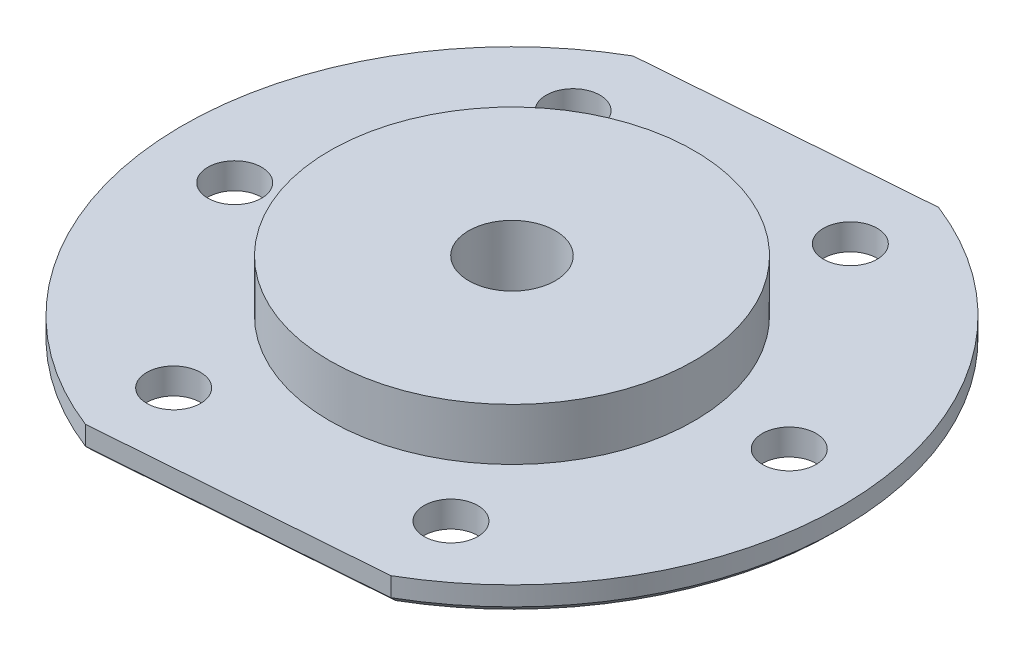
ISO-10303-21;
HEADER;
FILE_DESCRIPTION(('STEP AP214'),'2;1');
FILE_NAME('part.step','',(''),(''),'','','');
FILE_SCHEMA(('AUTOMOTIVE_DESIGN { 1 0 10303 214 1 1 1 1 }'));
ENDSEC;
DATA;
#1=APPLICATION_CONTEXT('core data for automotive mechanical design processes');
#2=APPLICATION_PROTOCOL_DEFINITION('international standard','automotive_design',2000,#1);
#3=PRODUCT_CONTEXT('',#1,'mechanical');
#4=PRODUCT('Part','Part','',(#3));
#5=PRODUCT_RELATED_PRODUCT_CATEGORY('part','',(#4));
#6=PRODUCT_DEFINITION_FORMATION('','',#4);
#7=PRODUCT_DEFINITION_CONTEXT('part definition',#1,'design');
#8=PRODUCT_DEFINITION('design','',#6,#7);
#9=PRODUCT_DEFINITION_SHAPE('','',#8);
#10=(LENGTH_UNIT() NAMED_UNIT(*) SI_UNIT(.MILLI.,.METRE.));
#11=(NAMED_UNIT(*) PLANE_ANGLE_UNIT() SI_UNIT($,.RADIAN.));
#12=(NAMED_UNIT(*) SI_UNIT($,.STERADIAN.) SOLID_ANGLE_UNIT());
#13=UNCERTAINTY_MEASURE_WITH_UNIT(LENGTH_MEASURE(1.E-05),#10,'distance_accuracy_value','');
#14=(GEOMETRIC_REPRESENTATION_CONTEXT(3) GLOBAL_UNCERTAINTY_ASSIGNED_CONTEXT((#13)) GLOBAL_UNIT_ASSIGNED_CONTEXT((#10,
#11,#12)) REPRESENTATION_CONTEXT('',''));
#15=CARTESIAN_POINT('',(0.,0.,0.));
#16=DIRECTION('',(0.,0.,1.));
#17=DIRECTION('',(1.,0.,0.));
#18=AXIS2_PLACEMENT_3D('',#15,#16,#17);
#19=CARTESIAN_POINT('',(0.,1.5,0.));
#20=DIRECTION('',(0.,-1.,0.));
#21=DIRECTION('',(0.,0.,-1.));
#22=AXIS2_PLACEMENT_3D('',#19,#20,#21);
#23=CYLINDRICAL_SURFACE('',#22,19.);
#24=DIRECTION('',(0.,1.,0.));
#25=VECTOR('',#24,1.);
#26=CARTESIAN_POINT('',(-9.48323529411764,0.,-16.4641503988636));
#27=LINE('',#26,#25);
#28=CARTESIAN_POINT('',(-9.48323529411764,0.399999999999998,-16.4641503988636));
#29=VERTEX_POINT('',#28);
#30=CARTESIAN_POINT('',(-9.48323529411764,1.5,-16.4641503988636));
#31=VERTEX_POINT('',#30);
#32=EDGE_CURVE('E195',#29,#31,#27,.T.);
#33=ORIENTED_EDGE('',*,*,#32,.F.);
#34=CARTESIAN_POINT('',(0.,0.399999999999998,0.));
#35=DIRECTION('',(0.,1.,0.));
#36=DIRECTION('',(0.,0.,1.));
#37=AXIS2_PLACEMENT_3D('',#34,#35,#36);
#38=CIRCLE('',#37,19.);
#39=CARTESIAN_POINT('',(-6.87848746298173,0.399999999999998,17.7111944888424));
#40=VERTEX_POINT('',#39);
#41=EDGE_CURVE('E130',#29,#40,#38,.T.);
#42=ORIENTED_EDGE('',*,*,#41,.T.);
#43=DIRECTION('',(0.,1.,0.));
#44=VECTOR('',#43,1.);
#45=CARTESIAN_POINT('',(-6.87848746298173,0.,17.7111944888424));
#46=LINE('',#45,#44);
#47=CARTESIAN_POINT('',(-6.87848746298173,1.5,17.7111944888425));
#48=VERTEX_POINT('',#47);
#49=EDGE_CURVE('E100',#40,#48,#46,.T.);
#50=ORIENTED_EDGE('',*,*,#49,.T.);
#51=CARTESIAN_POINT('',(0.,1.5,0.));
#52=DIRECTION('',(0.,1.,0.));
#53=DIRECTION('',(0.,0.,1.));
#54=AXIS2_PLACEMENT_3D('',#51,#52,#53);
#55=CIRCLE('',#54,19.);
#56=EDGE_CURVE('E109',#31,#48,#55,.T.);
#57=ORIENTED_EDGE('',*,*,#56,.F.);
#58=EDGE_LOOP('',(#33,#42,#50,#57));
#59=FACE_BOUND('',#58,.T.);
#60=ADVANCED_FACE('F35',(#59),#23,.T.);
#61=CARTESIAN_POINT('',(0.,1.5,0.));
#62=DIRECTION('',(0.,1.,0.));
#63=DIRECTION('',(0.,0.,1.));
#64=AXIS2_PLACEMENT_3D('',#61,#62,#63);
#65=PLANE('',#64);
#66=CARTESIAN_POINT('',(0.,1.5,0.));
#67=DIRECTION('',(0.,1.,0.));
#68=DIRECTION('',(0.,0.,1.));
#69=AXIS2_PLACEMENT_3D('',#66,#67,#68);
#70=CIRCLE('',#69,10.5);
#71=CARTESIAN_POINT('',(0.,1.5,10.5));
#72=VERTEX_POINT('',#71);
#73=EDGE_CURVE('E176',#72,#72,#70,.T.);
#74=ORIENTED_EDGE('',*,*,#73,.F.);
#75=EDGE_LOOP('',(#74));
#76=FACE_BOUND('',#75,.T.);
#77=DIRECTION('',(0.997108065509057,0.,-0.0759967479355899));
#78=VECTOR('',#77,1.);
#79=CARTESIAN_POINT('',(-9.48323529411764,1.5,-16.4641503988636));
#80=LINE('',#79,#78);
#81=CARTESIAN_POINT('',(6.87848746298173,1.5,-17.7111944888424));
#82=VERTEX_POINT('',#81);
#83=EDGE_CURVE('E198',#31,#82,#80,.T.);
#84=ORIENTED_EDGE('',*,*,#83,.F.);
#85=ORIENTED_EDGE('',*,*,#56,.T.);
#86=DIRECTION('',(-0.997108065509057,0.,0.0759967479355895));
#87=VECTOR('',#86,1.);
#88=CARTESIAN_POINT('',(-6.87848746298173,1.5,17.7111944888424));
#89=LINE('',#88,#87);
#90=CARTESIAN_POINT('',(9.48323529411765,1.5,16.4641503988636));
#91=VERTEX_POINT('',#90);
#92=EDGE_CURVE('E94',#91,#48,#89,.T.);
#93=ORIENTED_EDGE('',*,*,#92,.F.);
#94=EDGE_CURVE('E107',#91,#82,#55,.T.);
#95=ORIENTED_EDGE('',*,*,#94,.T.);
#96=EDGE_LOOP('',(#84,#85,#93,#95));
#97=FACE_BOUND('',#96,.T.);
#98=CARTESIAN_POINT('',(6.15443615108892,1.5,-13.3508994366904));
#99=DIRECTION('',(0.,1.,0.));
#100=DIRECTION('',(0.,0.,1.));
#101=AXIS2_PLACEMENT_3D('',#98,#99,#100);
#102=CIRCLE('',#101,1.55);
#103=CARTESIAN_POINT('',(6.15443615108892,1.5,-11.8008994366904));
#104=VERTEX_POINT('',#103);
#105=EDGE_CURVE('E206',#104,#104,#102,.T.);
#106=ORIENTED_EDGE('',*,*,#105,.F.);
#107=EDGE_LOOP('',(#106));
#108=FACE_BOUND('',#107,.T.);
#109=CARTESIAN_POINT('',(14.6394361510896,1.5,-1.34555166553371));
#110=DIRECTION('',(0.,1.,0.));
#111=DIRECTION('',(0.,0.,1.));
#112=AXIS2_PLACEMENT_3D('',#109,#110,#111);
#113=CIRCLE('',#112,1.55);
#114=CARTESIAN_POINT('',(14.6394361510896,1.5,0.204448334466295));
#115=VERTEX_POINT('',#114);
#116=EDGE_CURVE('E212',#115,#115,#113,.T.);
#117=ORIENTED_EDGE('',*,*,#116,.F.);
#118=EDGE_LOOP('',(#117));
#119=FACE_BOUND('',#118,.T.);
#120=CARTESIAN_POINT('',(8.48500000000136,1.5,12.0053477711562));
#121=DIRECTION('',(0.,1.,0.));
#122=DIRECTION('',(0.,0.,1.));
#123=AXIS2_PLACEMENT_3D('',#120,#121,#122);
#124=CIRCLE('',#123,1.55);
#125=CARTESIAN_POINT('',(8.48500000000136,1.5,13.5553477711562));
#126=VERTEX_POINT('',#125);
#127=EDGE_CURVE('E218',#126,#126,#124,.T.);
#128=ORIENTED_EDGE('',*,*,#127,.F.);
#129=EDGE_LOOP('',(#128));
#130=FACE_BOUND('',#129,.T.);
#131=CARTESIAN_POINT('',(-6.15443615108756,1.5,13.3508994366894));
#132=DIRECTION('',(0.,1.,0.));
#133=DIRECTION('',(0.,0.,1.));
#134=AXIS2_PLACEMENT_3D('',#131,#132,#133);
#135=CIRCLE('',#134,1.55);
#136=CARTESIAN_POINT('',(-6.15443615108756,1.5,14.9008994366894));
#137=VERTEX_POINT('',#136);
#138=EDGE_CURVE('E268',#137,#137,#135,.T.);
#139=ORIENTED_EDGE('',*,*,#138,.F.);
#140=EDGE_LOOP('',(#139));
#141=FACE_BOUND('',#140,.T.);
#142=CARTESIAN_POINT('',(-14.6394361510882,1.5,1.34555166553271));
#143=DIRECTION('',(0.,1.,0.));
#144=DIRECTION('',(0.,0.,1.));
#145=AXIS2_PLACEMENT_3D('',#142,#143,#144);
#146=CIRCLE('',#145,1.55);
#147=CARTESIAN_POINT('',(-14.6394361510882,1.5,2.89555166553271));
#148=VERTEX_POINT('',#147);
#149=EDGE_CURVE('E99',#148,#148,#146,.T.);
#150=ORIENTED_EDGE('',*,*,#149,.F.);
#151=EDGE_LOOP('',(#150));
#152=FACE_BOUND('',#151,.T.);
#153=CARTESIAN_POINT('',(-8.485,1.5,-12.0053477711572));
#154=DIRECTION('',(0.,1.,0.));
#155=DIRECTION('',(0.,0.,1.));
#156=AXIS2_PLACEMENT_3D('',#153,#154,#155);
#157=CIRCLE('',#156,1.55);
#158=CARTESIAN_POINT('',(-8.485,1.5,-10.4553477711572));
#159=VERTEX_POINT('',#158);
#160=EDGE_CURVE('E202',#159,#159,#157,.T.);
#161=ORIENTED_EDGE('',*,*,#160,.F.);
#162=EDGE_LOOP('',(#161));
#163=FACE_BOUND('',#162,.T.);
#164=ADVANCED_FACE('F105',(#76,#97,#108,#119,#130,#141,#152,#163),#65,.T.);
#165=CARTESIAN_POINT('',(0.,0.,0.));
#166=DIRECTION('',(0.,1.,0.));
#167=DIRECTION('',(0.,0.,1.));
#168=AXIS2_PLACEMENT_3D('',#165,#166,#167);
#169=PLANE('',#168);
#170=CARTESIAN_POINT('',(0.,0.,0.));
#171=DIRECTION('',(0.,1.,0.));
#172=DIRECTION('',(0.,0.,1.));
#173=AXIS2_PLACEMENT_3D('',#170,#171,#172);
#174=CIRCLE('',#173,18.6);
#175=CARTESIAN_POINT('',(6.81782610337125,0.,-17.3054109232977));
#176=VERTEX_POINT('',#175);
#177=CARTESIAN_POINT('',(9.36177653615871,0.,16.0722475120012));
#178=VERTEX_POINT('',#177);
#179=EDGE_CURVE('E117',#176,#178,#174,.F.);
#180=ORIENTED_EDGE('',*,*,#179,.T.);
#181=DIRECTION('',(-0.997108065509057,0.,0.0759967479355895));
#182=VECTOR('',#181,1.);
#183=CARTESIAN_POINT('',(1.27197521639372,0.,16.6888292176494));
#184=LINE('',#183,#182);
#185=CARTESIAN_POINT('',(-6.81782610337128,0.,17.3054109232976));
#186=VERTEX_POINT('',#185);
#187=EDGE_CURVE('E126',#178,#186,#184,.T.);
#188=ORIENTED_EDGE('',*,*,#187,.T.);
#189=CARTESIAN_POINT('',(0.,0.,0.));
#190=DIRECTION('',(0.,1.,0.));
#191=DIRECTION('',(0.,0.,1.));
#192=AXIS2_PLACEMENT_3D('',#189,#190,#191);
#193=CIRCLE('',#192,18.6);
#194=CARTESIAN_POINT('',(-9.3617765361587,0.,-16.0722475120012));
#195=VERTEX_POINT('',#194);
#196=EDGE_CURVE('E124',#186,#195,#193,.F.);
#197=ORIENTED_EDGE('',*,*,#196,.T.);
#198=DIRECTION('',(0.997108065509057,0.,-0.0759967479355899));
#199=VECTOR('',#198,1.);
#200=CARTESIAN_POINT('',(-1.27197521639372,0.,-16.6888292176494));
#201=LINE('',#200,#199);
#202=EDGE_CURVE('E115',#195,#176,#201,.T.);
#203=ORIENTED_EDGE('',*,*,#202,.T.);
#204=EDGE_LOOP('',(#180,#188,#197,#203));
#205=FACE_BOUND('',#204,.T.);
#206=CARTESIAN_POINT('',(6.15443615108892,0.,-13.3508994366904));
#207=DIRECTION('',(0.,1.,0.));
#208=DIRECTION('',(0.,0.,1.));
#209=AXIS2_PLACEMENT_3D('',#206,#207,#208);
#210=CIRCLE('',#209,1.55);
#211=CARTESIAN_POINT('',(6.15443615108892,0.,-11.8008994366904));
#212=VERTEX_POINT('',#211);
#213=EDGE_CURVE('E200',#212,#212,#210,.T.);
#214=ORIENTED_EDGE('',*,*,#213,.T.);
#215=EDGE_LOOP('',(#214));
#216=FACE_BOUND('',#215,.T.);
#217=CARTESIAN_POINT('',(14.6394361510896,0.,-1.34555166553371));
#218=DIRECTION('',(0.,1.,0.));
#219=DIRECTION('',(0.,0.,1.));
#220=AXIS2_PLACEMENT_3D('',#217,#218,#219);
#221=CIRCLE('',#220,1.55);
#222=CARTESIAN_POINT('',(14.6394361510896,0.,0.204448334466295));
#223=VERTEX_POINT('',#222);
#224=EDGE_CURVE('E209',#223,#223,#221,.T.);
#225=ORIENTED_EDGE('',*,*,#224,.T.);
#226=EDGE_LOOP('',(#225));
#227=FACE_BOUND('',#226,.T.);
#228=CARTESIAN_POINT('',(8.48500000000136,0.,12.0053477711562));
#229=DIRECTION('',(0.,1.,0.));
#230=DIRECTION('',(0.,0.,1.));
#231=AXIS2_PLACEMENT_3D('',#228,#229,#230);
#232=CIRCLE('',#231,1.55);
#233=CARTESIAN_POINT('',(8.48500000000136,0.,13.5553477711562));
#234=VERTEX_POINT('',#233);
#235=EDGE_CURVE('E215',#234,#234,#232,.T.);
#236=ORIENTED_EDGE('',*,*,#235,.T.);
#237=EDGE_LOOP('',(#236));
#238=FACE_BOUND('',#237,.T.);
#239=CARTESIAN_POINT('',(-6.15443615108756,0.,13.3508994366894));
#240=DIRECTION('',(0.,1.,0.));
#241=DIRECTION('',(0.,0.,1.));
#242=AXIS2_PLACEMENT_3D('',#239,#240,#241);
#243=CIRCLE('',#242,1.55);
#244=CARTESIAN_POINT('',(-6.15443615108756,0.,14.9008994366894));
#245=VERTEX_POINT('',#244);
#246=EDGE_CURVE('E221',#245,#245,#243,.T.);
#247=ORIENTED_EDGE('',*,*,#246,.T.);
#248=EDGE_LOOP('',(#247));
#249=FACE_BOUND('',#248,.T.);
#250=CARTESIAN_POINT('',(-14.6394361510882,0.,1.34555166553271));
#251=DIRECTION('',(0.,1.,0.));
#252=DIRECTION('',(0.,0.,1.));
#253=AXIS2_PLACEMENT_3D('',#250,#251,#252);
#254=CIRCLE('',#253,1.55);
#255=CARTESIAN_POINT('',(-14.6394361510882,0.,2.89555166553271));
#256=VERTEX_POINT('',#255);
#257=EDGE_CURVE('E271',#256,#256,#254,.T.);
#258=ORIENTED_EDGE('',*,*,#257,.T.);
#259=EDGE_LOOP('',(#258));
#260=FACE_BOUND('',#259,.T.);
#261=CARTESIAN_POINT('',(-8.485,0.,-12.0053477711572));
#262=DIRECTION('',(0.,1.,0.));
#263=DIRECTION('',(0.,0.,1.));
#264=AXIS2_PLACEMENT_3D('',#261,#262,#263);
#265=CIRCLE('',#264,1.55);
#266=CARTESIAN_POINT('',(-8.485,0.,-10.4553477711572));
#267=VERTEX_POINT('',#266);
#268=EDGE_CURVE('E222',#267,#267,#265,.T.);
#269=ORIENTED_EDGE('',*,*,#268,.T.);
#270=EDGE_LOOP('',(#269));
#271=FACE_BOUND('',#270,.T.);
#272=CARTESIAN_POINT('',(0.,0.,0.));
#273=DIRECTION('',(0.,1.,0.));
#274=DIRECTION('',(0.,0.,1.));
#275=AXIS2_PLACEMENT_3D('',#272,#273,#274);
#276=CIRCLE('',#275,10.);
#277=CARTESIAN_POINT('',(0.,0.,10.));
#278=VERTEX_POINT('',#277);
#279=EDGE_CURVE('E119',#278,#278,#276,.T.);
#280=ORIENTED_EDGE('',*,*,#279,.T.);
#281=EDGE_LOOP('',(#280));
#282=FACE_BOUND('',#281,.T.);
#283=ADVANCED_FACE('F230',(#205,#216,#227,#238,#249,#260,#271,#282),#169,.F.);
#284=DIRECTION('',(0.,1.,0.));
#285=VECTOR('',#284,1.);
#286=CARTESIAN_POINT('',(9.48323529411765,0.,16.4641503988636));
#287=LINE('',#286,#285);
#288=CARTESIAN_POINT('',(9.48323529411765,0.399999999999998,16.4641503988636));
#289=VERTEX_POINT('',#288);
#290=EDGE_CURVE('E90',#289,#91,#287,.T.);
#291=ORIENTED_EDGE('',*,*,#290,.F.);
#292=CARTESIAN_POINT('',(0.,0.399999999999998,0.));
#293=DIRECTION('',(0.,1.,0.));
#294=DIRECTION('',(0.,0.,1.));
#295=AXIS2_PLACEMENT_3D('',#292,#293,#294);
#296=CIRCLE('',#295,19.);
#297=CARTESIAN_POINT('',(6.87848746298173,0.399999999999998,-17.7111944888424));
#298=VERTEX_POINT('',#297);
#299=EDGE_CURVE('E52',#289,#298,#296,.T.);
#300=ORIENTED_EDGE('',*,*,#299,.T.);
#301=DIRECTION('',(0.,1.,0.));
#302=VECTOR('',#301,1.);
#303=CARTESIAN_POINT('',(6.87848746298173,0.,-17.7111944888424));
#304=LINE('',#303,#302);
#305=EDGE_CURVE('E113',#298,#82,#304,.T.);
#306=ORIENTED_EDGE('',*,*,#305,.T.);
#307=ORIENTED_EDGE('',*,*,#94,.F.);
#308=EDGE_LOOP('',(#291,#300,#306,#307));
#309=FACE_BOUND('',#308,.T.);
#310=ADVANCED_FACE('F112',(#309),#23,.T.);
#311=CARTESIAN_POINT('',(0.,1.5,0.));
#312=DIRECTION('',(0.,-1.,0.));
#313=DIRECTION('',(0.,0.,-1.));
#314=AXIS2_PLACEMENT_3D('',#311,#312,#313);
#315=CYLINDRICAL_SURFACE('',#314,10.);
#316=CARTESIAN_POINT('',(0.,1.5,0.));
#317=DIRECTION('',(0.,1.,0.));
#318=DIRECTION('',(0.,0.,1.));
#319=AXIS2_PLACEMENT_3D('',#316,#317,#318);
#320=CIRCLE('',#319,10.);
#321=CARTESIAN_POINT('',(0.,1.5,10.));
#322=VERTEX_POINT('',#321);
#323=EDGE_CURVE('E110',#322,#322,#320,.T.);
#324=ORIENTED_EDGE('',*,*,#323,.T.);
#325=EDGE_LOOP('',(#324));
#326=FACE_BOUND('',#325,.T.);
#327=ORIENTED_EDGE('',*,*,#279,.F.);
#328=EDGE_LOOP('',(#327));
#329=FACE_BOUND('',#328,.T.);
#330=ADVANCED_FACE('F241',(#326,#329),#315,.F.);
#331=CARTESIAN_POINT('',(-6.87848746298173,0.,17.7111944888424));
#332=DIRECTION('',(-0.0759967479355895,0.,-0.997108065509057));
#333=DIRECTION('',(-0.997108065509057,0.,0.0759967479355895));
#334=AXIS2_PLACEMENT_3D('',#331,#332,#333);
#335=PLANE('',#334);
#336=ORIENTED_EDGE('',*,*,#49,.F.);
#337=DIRECTION('',(0.997108065509057,0.,-0.0759967479355895));
#338=VECTOR('',#337,1.);
#339=CARTESIAN_POINT('',(-6.87848746298173,0.399999999999997,17.7111944888424));
#340=LINE('',#339,#338);
#341=EDGE_CURVE('E97',#40,#289,#340,.T.);
#342=ORIENTED_EDGE('',*,*,#341,.T.);
#343=ORIENTED_EDGE('',*,*,#290,.T.);
#344=ORIENTED_EDGE('',*,*,#92,.T.);
#345=EDGE_LOOP('',(#336,#342,#343,#344));
#346=FACE_BOUND('',#345,.T.);
#347=ADVANCED_FACE('F93',(#346),#335,.F.);
#348=CARTESIAN_POINT('',(-9.48323529411764,0.,-16.4641503988636));
#349=DIRECTION('',(0.0759967479355899,0.,0.997108065509057));
#350=DIRECTION('',(0.997108065509057,0.,-0.0759967479355899));
#351=AXIS2_PLACEMENT_3D('',#348,#349,#350);
#352=PLANE('',#351);
#353=ORIENTED_EDGE('',*,*,#305,.F.);
#354=DIRECTION('',(-0.997108065509057,0.,0.0759967479355899));
#355=VECTOR('',#354,1.);
#356=CARTESIAN_POINT('',(-9.48323529411764,0.399999999999998,-16.4641503988636));
#357=LINE('',#356,#355);
#358=EDGE_CURVE('E45',#298,#29,#357,.T.);
#359=ORIENTED_EDGE('',*,*,#358,.T.);
#360=ORIENTED_EDGE('',*,*,#32,.T.);
#361=ORIENTED_EDGE('',*,*,#83,.T.);
#362=EDGE_LOOP('',(#353,#359,#360,#361));
#363=FACE_BOUND('',#362,.T.);
#364=ADVANCED_FACE('F251',(#363),#352,.F.);
#365=CARTESIAN_POINT('',(-8.485,0.,-12.0053477711572));
#366=DIRECTION('',(0.,1.,0.));
#367=DIRECTION('',(0.,0.,1.));
#368=AXIS2_PLACEMENT_3D('',#365,#366,#367);
#369=CYLINDRICAL_SURFACE('',#368,1.55);
#370=ORIENTED_EDGE('',*,*,#268,.F.);
#371=EDGE_LOOP('',(#370));
#372=FACE_BOUND('',#371,.T.);
#373=ORIENTED_EDGE('',*,*,#160,.T.);
#374=EDGE_LOOP('',(#373));
#375=FACE_BOUND('',#374,.T.);
#376=ADVANCED_FACE('F227',(#372,#375),#369,.F.);
#377=CARTESIAN_POINT('',(-14.6394361510882,0.,1.34555166553271));
#378=DIRECTION('',(0.,1.,0.));
#379=DIRECTION('',(0.,0.,1.));
#380=AXIS2_PLACEMENT_3D('',#377,#378,#379);
#381=CYLINDRICAL_SURFACE('',#380,1.55);
#382=ORIENTED_EDGE('',*,*,#257,.F.);
#383=EDGE_LOOP('',(#382));
#384=FACE_BOUND('',#383,.T.);
#385=ORIENTED_EDGE('',*,*,#149,.T.);
#386=EDGE_LOOP('',(#385));
#387=FACE_BOUND('',#386,.T.);
#388=ADVANCED_FACE('F277',(#384,#387),#381,.F.);
#389=CARTESIAN_POINT('',(-6.15443615108756,0.,13.3508994366894));
#390=DIRECTION('',(0.,1.,0.));
#391=DIRECTION('',(0.,0.,1.));
#392=AXIS2_PLACEMENT_3D('',#389,#390,#391);
#393=CYLINDRICAL_SURFACE('',#392,1.55);
#394=ORIENTED_EDGE('',*,*,#246,.F.);
#395=EDGE_LOOP('',(#394));
#396=FACE_BOUND('',#395,.T.);
#397=ORIENTED_EDGE('',*,*,#138,.T.);
#398=EDGE_LOOP('',(#397));
#399=FACE_BOUND('',#398,.T.);
#400=ADVANCED_FACE('F280',(#396,#399),#393,.F.);
#401=CARTESIAN_POINT('',(8.48500000000136,0.,12.0053477711562));
#402=DIRECTION('',(0.,1.,0.));
#403=DIRECTION('',(0.,0.,1.));
#404=AXIS2_PLACEMENT_3D('',#401,#402,#403);
#405=CYLINDRICAL_SURFACE('',#404,1.55);
#406=ORIENTED_EDGE('',*,*,#235,.F.);
#407=EDGE_LOOP('',(#406));
#408=FACE_BOUND('',#407,.T.);
#409=ORIENTED_EDGE('',*,*,#127,.T.);
#410=EDGE_LOOP('',(#409));
#411=FACE_BOUND('',#410,.T.);
#412=ADVANCED_FACE('F287',(#408,#411),#405,.F.);
#413=CARTESIAN_POINT('',(14.6394361510896,0.,-1.34555166553371));
#414=DIRECTION('',(0.,1.,0.));
#415=DIRECTION('',(0.,0.,1.));
#416=AXIS2_PLACEMENT_3D('',#413,#414,#415);
#417=CYLINDRICAL_SURFACE('',#416,1.55);
#418=ORIENTED_EDGE('',*,*,#224,.F.);
#419=EDGE_LOOP('',(#418));
#420=FACE_BOUND('',#419,.T.);
#421=ORIENTED_EDGE('',*,*,#116,.T.);
#422=EDGE_LOOP('',(#421));
#423=FACE_BOUND('',#422,.T.);
#424=ADVANCED_FACE('F300',(#420,#423),#417,.F.);
#425=CARTESIAN_POINT('',(6.15443615108892,0.,-13.3508994366904));
#426=DIRECTION('',(0.,1.,0.));
#427=DIRECTION('',(0.,0.,1.));
#428=AXIS2_PLACEMENT_3D('',#425,#426,#427);
#429=CYLINDRICAL_SURFACE('',#428,1.55);
#430=ORIENTED_EDGE('',*,*,#213,.F.);
#431=EDGE_LOOP('',(#430));
#432=FACE_BOUND('',#431,.T.);
#433=ORIENTED_EDGE('',*,*,#105,.T.);
#434=EDGE_LOOP('',(#433));
#435=FACE_BOUND('',#434,.T.);
#436=ADVANCED_FACE('F296',(#432,#435),#429,.F.);
#437=CARTESIAN_POINT('',(0.,1.5,0.));
#438=DIRECTION('',(0.,1.,0.));
#439=DIRECTION('',(0.,0.,1.));
#440=AXIS2_PLACEMENT_3D('',#437,#438,#439);
#441=PLANE('',#440);
#442=CARTESIAN_POINT('',(0.,1.5,0.));
#443=DIRECTION('',(0.,1.,0.));
#444=DIRECTION('',(0.,0.,1.));
#445=AXIS2_PLACEMENT_3D('',#442,#443,#444);
#446=CIRCLE('',#445,5.);
#447=CARTESIAN_POINT('',(0.,1.5,5.));
#448=VERTEX_POINT('',#447);
#449=EDGE_CURVE('E11',#448,#448,#446,.F.);
#450=ORIENTED_EDGE('',*,*,#449,.F.);
#451=EDGE_LOOP('',(#450));
#452=FACE_BOUND('',#451,.T.);
#453=ORIENTED_EDGE('',*,*,#323,.F.);
#454=EDGE_LOOP('',(#453));
#455=FACE_BOUND('',#454,.T.);
#456=ADVANCED_FACE('F299',(#452,#455),#441,.F.);
#457=CARTESIAN_POINT('',(0.,4.5,0.));
#458=DIRECTION('',(0.,-1.,0.));
#459=DIRECTION('',(0.,0.,-1.));
#460=AXIS2_PLACEMENT_3D('',#457,#458,#459);
#461=CYLINDRICAL_SURFACE('',#460,10.5);
#462=CARTESIAN_POINT('',(0.,4.5,0.));
#463=DIRECTION('',(0.,1.,0.));
#464=DIRECTION('',(0.,0.,1.));
#465=AXIS2_PLACEMENT_3D('',#462,#463,#464);
#466=CIRCLE('',#465,10.5);
#467=CARTESIAN_POINT('',(0.,4.5,10.5));
#468=VERTEX_POINT('',#467);
#469=EDGE_CURVE('E260',#468,#468,#466,.T.);
#470=ORIENTED_EDGE('',*,*,#469,.F.);
#471=EDGE_LOOP('',(#470));
#472=FACE_BOUND('',#471,.T.);
#473=ORIENTED_EDGE('',*,*,#73,.T.);
#474=EDGE_LOOP('',(#473));
#475=FACE_BOUND('',#474,.T.);
#476=ADVANCED_FACE('F338',(#472,#475),#461,.T.);
#477=CARTESIAN_POINT('',(0.,4.5,0.));
#478=DIRECTION('',(0.,1.,0.));
#479=DIRECTION('',(0.,0.,1.));
#480=AXIS2_PLACEMENT_3D('',#477,#478,#479);
#481=PLANE('',#480);
#482=CARTESIAN_POINT('',(0.,4.5,0.));
#483=DIRECTION('',(0.,-1.,0.));
#484=DIRECTION('',(0.,0.,-1.));
#485=AXIS2_PLACEMENT_3D('',#482,#483,#484);
#486=CIRCLE('',#485,2.5);
#487=CARTESIAN_POINT('',(0.,4.5,-2.5));
#488=VERTEX_POINT('',#487);
#489=EDGE_CURVE('E476',#488,#488,#486,.T.);
#490=ORIENTED_EDGE('',*,*,#489,.T.);
#491=EDGE_LOOP('',(#490));
#492=FACE_BOUND('',#491,.T.);
#493=ORIENTED_EDGE('',*,*,#469,.T.);
#494=EDGE_LOOP('',(#493));
#495=FACE_BOUND('',#494,.T.);
#496=ADVANCED_FACE('F348',(#492,#495),#481,.T.);
#497=CARTESIAN_POINT('',(-1.27197521639372,0.,-16.6888292176494));
#498=DIRECTION('',(0.0537378158133807,0.707106781186543,0.705061874697259));
#499=DIRECTION('',(0.997108065509057,0.,-0.0759967479355899));
#500=AXIS2_PLACEMENT_3D('',#497,#498,#499);
#501=PLANE('',#500);
#502=CARTESIAN_POINT('',(-9.3617765361587,0.,-16.0722475120012));
#503=CARTESIAN_POINT('',(-9.38210172223119,0.0666571896361612,-16.1375489009336));
#504=CARTESIAN_POINT('',(-9.40238587845147,0.133319117856325,-16.2028581693724));
#505=CARTESIAN_POINT('',(-9.44287213110412,0.266652451189696,-16.3334924649933));
#506=CARTESIAN_POINT('',(-9.46307422753682,0.333323856302865,-16.3988174921753));
#507=CARTESIAN_POINT('',(-9.48323529411765,0.399999999999997,-16.4641503988636));
#508=B_SPLINE_CURVE_WITH_KNOTS('',3,(#502,#503,#504,#505,#506,#507),.UNSPECIFIED.,.F.,.F.,(4,2,
4),(0.,0.286504872392196,0.573009743602727),.UNSPECIFIED.);
#509=EDGE_CURVE('E177',#29,#195,#508,.F.);
#510=ORIENTED_EDGE('',*,*,#509,.F.);
#511=ORIENTED_EDGE('',*,*,#358,.F.);
#512=CARTESIAN_POINT('',(6.87848746298173,0.399999999999998,-17.7111944888424));
#513=CARTESIAN_POINT('',(6.86846073657264,0.333323856302864,-17.6435607542159));
#514=CARTESIAN_POINT('',(6.85839226007773,0.266652451189695,-17.5759285898436));
#515=CARTESIAN_POINT('',(6.83817180687458,0.133319117856323,-17.4406674013286));
#516=CARTESIAN_POINT('',(6.828019830166,0.0666571896361604,-17.373038377186));
#517=CARTESIAN_POINT('',(6.81782610337125,0.,-17.3054109232977));
#518=B_SPLINE_CURVE_WITH_KNOTS('',3,(#512,#513,#514,#515,#516,#517),.UNSPECIFIED.,.F.,.F.,(4,2,
4),(0.,0.286504871210532,0.573009743602727),.UNSPECIFIED.);
#519=EDGE_CURVE('E170',#176,#298,#518,.F.);
#520=ORIENTED_EDGE('',*,*,#519,.F.);
#521=ORIENTED_EDGE('',*,*,#202,.F.);
#522=EDGE_LOOP('',(#510,#511,#520,#521));
#523=FACE_BOUND('',#522,.T.);
#524=ADVANCED_FACE('F38',(#523),#501,.F.);
#525=CARTESIAN_POINT('',(0.,0.399999999999998,0.));
#526=DIRECTION('',(0.,1.,0.));
#527=DIRECTION('',(0.,0.,1.));
#528=AXIS2_PLACEMENT_3D('',#525,#526,#527);
#529=CONICAL_SURFACE('',#528,19.,0.785398163397448);
#530=ORIENTED_EDGE('',*,*,#519,.T.);
#531=ORIENTED_EDGE('',*,*,#299,.F.);
#532=CARTESIAN_POINT('',(9.48323529411765,0.399999999999997,16.4641503988636));
#533=CARTESIAN_POINT('',(9.46307422753683,0.333323856302864,16.3988174921753));
#534=CARTESIAN_POINT('',(9.44287213110413,0.266652451189695,16.3334924649933));
#535=CARTESIAN_POINT('',(9.40238587845149,0.133319117856324,16.2028581693724));
#536=CARTESIAN_POINT('',(9.38210172223121,0.0666571896361605,16.1375489009336));
#537=CARTESIAN_POINT('',(9.36177653615872,0.,16.0722475120012));
#538=B_SPLINE_CURVE_WITH_KNOTS('',3,(#532,#533,#534,#535,#536,#537),.UNSPECIFIED.,.F.,.F.,(4,2,
4),(0.,0.286504871210532,0.573009743602728),.UNSPECIFIED.);
#539=EDGE_CURVE('E142',#178,#289,#538,.F.);
#540=ORIENTED_EDGE('',*,*,#539,.F.);
#541=ORIENTED_EDGE('',*,*,#179,.F.);
#542=EDGE_LOOP('',(#530,#531,#540,#541));
#543=FACE_BOUND('',#542,.T.);
#544=ADVANCED_FACE('F162',(#543),#529,.T.);
#545=CARTESIAN_POINT('',(0.,0.399999999999998,0.));
#546=DIRECTION('',(0.,1.,0.));
#547=DIRECTION('',(0.,0.,1.));
#548=AXIS2_PLACEMENT_3D('',#545,#546,#547);
#549=CONICAL_SURFACE('',#548,19.,0.785398163397448);
#550=ORIENTED_EDGE('',*,*,#509,.T.);
#551=ORIENTED_EDGE('',*,*,#196,.F.);
#552=CARTESIAN_POINT('',(-6.81782610337128,0.,17.3054109232976));
#553=CARTESIAN_POINT('',(-6.82801983016603,0.0666571896361604,17.373038377186));
#554=CARTESIAN_POINT('',(-6.83817180687461,0.133319117856324,17.4406674013286));
#555=CARTESIAN_POINT('',(-6.85839226007775,0.266652451189695,17.5759285898436));
#556=CARTESIAN_POINT('',(-6.86846073657266,0.333323856302865,17.6435607542159));
#557=CARTESIAN_POINT('',(-6.87848746298175,0.399999999999998,17.7111944888424));
#558=B_SPLINE_CURVE_WITH_KNOTS('',3,(#552,#553,#554,#555,#556,#557),.UNSPECIFIED.,.F.,.F.,(4,2,
4),(0.,0.286504872392195,0.57300974360273),.UNSPECIFIED.);
#559=EDGE_CURVE('E134',#40,#186,#558,.F.);
#560=ORIENTED_EDGE('',*,*,#559,.F.);
#561=ORIENTED_EDGE('',*,*,#41,.F.);
#562=EDGE_LOOP('',(#550,#551,#560,#561));
#563=FACE_BOUND('',#562,.T.);
#564=ADVANCED_FACE('F150',(#563),#549,.T.);
#565=CARTESIAN_POINT('',(1.27197521639372,0.,16.6888292176494));
#566=DIRECTION('',(-0.0537378158133801,0.707106781186547,-0.705061874697255));
#567=DIRECTION('',(-0.997108065509057,0.,0.0759967479355895));
#568=AXIS2_PLACEMENT_3D('',#565,#566,#567);
#569=PLANE('',#568);
#570=ORIENTED_EDGE('',*,*,#539,.T.);
#571=ORIENTED_EDGE('',*,*,#341,.F.);
#572=ORIENTED_EDGE('',*,*,#559,.T.);
#573=ORIENTED_EDGE('',*,*,#187,.F.);
#574=EDGE_LOOP('',(#570,#571,#572,#573));
#575=FACE_BOUND('',#574,.T.);
#576=ADVANCED_FACE('F154',(#575),#569,.F.);
#577=CARTESIAN_POINT('',(0.,-1.5,0.));
#578=DIRECTION('',(0.,1.,0.));
#579=DIRECTION('',(0.,0.,1.));
#580=AXIS2_PLACEMENT_3D('',#577,#578,#579);
#581=CYLINDRICAL_SURFACE('',#580,5.);
#582=CARTESIAN_POINT('',(0.,-1.5,0.));
#583=DIRECTION('',(0.,-1.,0.));
#584=DIRECTION('',(0.,0.,-1.));
#585=AXIS2_PLACEMENT_3D('',#582,#583,#584);
#586=CIRCLE('',#585,5.);
#587=CARTESIAN_POINT('',(0.,-1.5,-5.));
#588=VERTEX_POINT('',#587);
#589=EDGE_CURVE('E143',#588,#588,#586,.T.);
#590=ORIENTED_EDGE('',*,*,#589,.F.);
#591=EDGE_LOOP('',(#590));
#592=FACE_BOUND('',#591,.T.);
#593=ORIENTED_EDGE('',*,*,#449,.T.);
#594=EDGE_LOOP('',(#593));
#595=FACE_BOUND('',#594,.T.);
#596=ADVANCED_FACE('F160',(#592,#595),#581,.T.);
#597=CARTESIAN_POINT('',(0.,-1.5,0.));
#598=DIRECTION('',(0.,-1.,0.));
#599=DIRECTION('',(0.,0.,-1.));
#600=AXIS2_PLACEMENT_3D('',#597,#598,#599);
#601=PLANE('',#600);
#602=CARTESIAN_POINT('',(0.,-1.5,0.));
#603=DIRECTION('',(0.,-1.,0.));
#604=DIRECTION('',(0.,0.,-1.));
#605=AXIS2_PLACEMENT_3D('',#602,#603,#604);
#606=CIRCLE('',#605,2.5);
#607=CARTESIAN_POINT('',(0.,-1.5,-2.5));
#608=VERTEX_POINT('',#607);
#609=EDGE_CURVE('E479',#608,#608,#606,.T.);
#610=ORIENTED_EDGE('',*,*,#609,.F.);
#611=EDGE_LOOP('',(#610));
#612=FACE_BOUND('',#611,.T.);
#613=ORIENTED_EDGE('',*,*,#589,.T.);
#614=EDGE_LOOP('',(#613));
#615=FACE_BOUND('',#614,.T.);
#616=ADVANCED_FACE('F381',(#612,#615),#601,.T.);
#617=CARTESIAN_POINT('',(0.,4.5,0.));
#618=DIRECTION('',(0.,-1.,0.));
#619=DIRECTION('',(0.,0.,-1.));
#620=AXIS2_PLACEMENT_3D('',#617,#618,#619);
#621=CYLINDRICAL_SURFACE('',#620,2.5);
#622=CARTESIAN_POINT('',(0.,4.5,-2.5));
#623=CARTESIAN_POINT('',(0.,4.4375,-2.5));
#624=CARTESIAN_POINT('',(0.,4.375,-2.5));
#625=CARTESIAN_POINT('',(0.,4.25,-2.5));
#626=CARTESIAN_POINT('',(0.,4.1875,-2.5));
#627=CARTESIAN_POINT('',(0.,4.0625,-2.5));
#628=CARTESIAN_POINT('',(0.,4.,-2.5));
#629=CARTESIAN_POINT('',(0.,3.875,-2.5));
#630=CARTESIAN_POINT('',(0.,3.8125,-2.5));
#631=CARTESIAN_POINT('',(0.,3.6875,-2.5));
#632=CARTESIAN_POINT('',(0.,3.625,-2.5));
#633=CARTESIAN_POINT('',(0.,3.5,-2.5));
#634=CARTESIAN_POINT('',(0.,3.4375,-2.5));
#635=CARTESIAN_POINT('',(0.,3.3125,-2.5));
#636=CARTESIAN_POINT('',(0.,3.25,-2.5));
#637=CARTESIAN_POINT('',(0.,3.125,-2.5));
#638=CARTESIAN_POINT('',(0.,3.0625,-2.5));
#639=CARTESIAN_POINT('',(0.,2.9375,-2.5));
#640=CARTESIAN_POINT('',(0.,2.875,-2.5));
#641=CARTESIAN_POINT('',(0.,2.75,-2.5));
#642=CARTESIAN_POINT('',(0.,2.6875,-2.5));
#643=CARTESIAN_POINT('',(0.,2.5625,-2.5));
#644=CARTESIAN_POINT('',(0.,2.5,-2.5));
#645=CARTESIAN_POINT('',(0.,2.375,-2.5));
#646=CARTESIAN_POINT('',(0.,2.3125,-2.5));
#647=CARTESIAN_POINT('',(0.,2.1875,-2.5));
#648=CARTESIAN_POINT('',(0.,2.125,-2.5));
#649=CARTESIAN_POINT('',(0.,2.,-2.5));
#650=CARTESIAN_POINT('',(0.,1.9375,-2.5));
#651=CARTESIAN_POINT('',(0.,1.8125,-2.5));
#652=CARTESIAN_POINT('',(0.,1.75,-2.5));
#653=CARTESIAN_POINT('',(0.,1.625,-2.5));
#654=CARTESIAN_POINT('',(0.,1.5625,-2.5));
#655=CARTESIAN_POINT('',(0.,1.4375,-2.5));
#656=CARTESIAN_POINT('',(0.,1.375,-2.5));
#657=CARTESIAN_POINT('',(0.,1.25,-2.5));
#658=CARTESIAN_POINT('',(0.,1.1875,-2.5));
#659=CARTESIAN_POINT('',(0.,1.0625,-2.5));
#660=CARTESIAN_POINT('',(0.,1.,-2.5));
#661=CARTESIAN_POINT('',(0.,0.875,-2.5));
#662=CARTESIAN_POINT('',(0.,0.8125,-2.5));
#663=CARTESIAN_POINT('',(0.,0.6875,-2.5));
#664=CARTESIAN_POINT('',(0.,0.625,-2.5));
#665=CARTESIAN_POINT('',(0.,0.5,-2.5));
#666=CARTESIAN_POINT('',(0.,0.4375,-2.5));
#667=CARTESIAN_POINT('',(0.,0.3125,-2.5));
#668=CARTESIAN_POINT('',(0.,0.25,-2.5));
#669=CARTESIAN_POINT('',(0.,0.125,-2.5));
#670=CARTESIAN_POINT('',(0.,0.0625,-2.5));
#671=CARTESIAN_POINT('',(0.,-0.0625,-2.5));
#672=CARTESIAN_POINT('',(0.,-0.125,-2.5));
#673=CARTESIAN_POINT('',(0.,-0.25,-2.5));
#674=CARTESIAN_POINT('',(0.,-0.3125,-2.5));
#675=CARTESIAN_POINT('',(0.,-0.4375,-2.5));
#676=CARTESIAN_POINT('',(0.,-0.5,-2.5));
#677=CARTESIAN_POINT('',(0.,-0.625,-2.5));
#678=CARTESIAN_POINT('',(0.,-0.6875,-2.5));
#679=CARTESIAN_POINT('',(0.,-0.8125,-2.5));
#680=CARTESIAN_POINT('',(0.,-0.875,-2.5));
#681=CARTESIAN_POINT('',(0.,-1.,-2.5));
#682=CARTESIAN_POINT('',(0.,-1.0625,-2.5));
#683=CARTESIAN_POINT('',(0.,-1.1875,-2.5));
#684=CARTESIAN_POINT('',(0.,-1.25,-2.5));
#685=CARTESIAN_POINT('',(0.,-1.375,-2.5));
#686=CARTESIAN_POINT('',(0.,-1.4375,-2.5));
#687=CARTESIAN_POINT('',(0.,-1.5,-2.5));
#688=B_SPLINE_CURVE_WITH_KNOTS('',3,(#622,#623,#624,#625,#626,#627,#628,#629,#630,#631,#632,
#633,#634,#635,#636,#637,#638,#639,#640,#641,#642,#643,#644,#645,#646,#647,#648,#649,#650,#651,
#652,#653,#654,#655,#656,#657,#658,#659,#660,#661,#662,#663,#664,#665,#666,#667,#668,#669,#670,
#671,#672,#673,#674,#675,#676,#677,#678,#679,#680,#681,#682,#683,#684,#685,#686,#687),
.UNSPECIFIED.,.F.,.F.,(4,2,2,2,2,2,2,2,2,2,2,2,2,2,2,2,2,2,2,2,2,2,2,2,2,2,2,2,2,2,2,2,4),(0.,
0.187499999999999,0.374999999999999,0.5625,0.75,0.9375,1.125,1.3125,1.5,1.6875,1.875,2.0625,
2.25,2.4375,2.625,2.8125,3.,3.1875,3.375,3.5625,3.75,3.9375,4.125,4.3125,4.5,4.6875,4.875,
5.0625,5.25,5.4375,5.625,5.8125,6.),.UNSPECIFIED.);
#689=EDGE_CURVE('BSEAM388',#488,#608,#688,.T.);
#690=ORIENTED_EDGE('',*,*,#489,.F.);
#691=ORIENTED_EDGE('',*,*,#609,.T.);
#692=ORIENTED_EDGE('',*,*,#689,.T.);
#693=ORIENTED_EDGE('',*,*,#689,.F.);
#694=EDGE_LOOP('',(#690,#692,#691,#693));
#695=FACE_BOUND('',#694,.T.);
#696=ADVANCED_FACE('F388',(#695),#621,.F.);
#697=CLOSED_SHELL('',(#60,#164,#283,#310,#330,#347,#364,#376,#388,#400,#412,#424,#436,#456,#476,
#496,#524,#544,#564,#576,#596,#616,#696));
#698=MANIFOLD_SOLID_BREP('B2',#697);
#699=ADVANCED_BREP_SHAPE_REPRESENTATION('',(#18,#698),#14);
#700=SHAPE_DEFINITION_REPRESENTATION(#9,#699);
ENDSEC;
END-ISO-10303-21;
